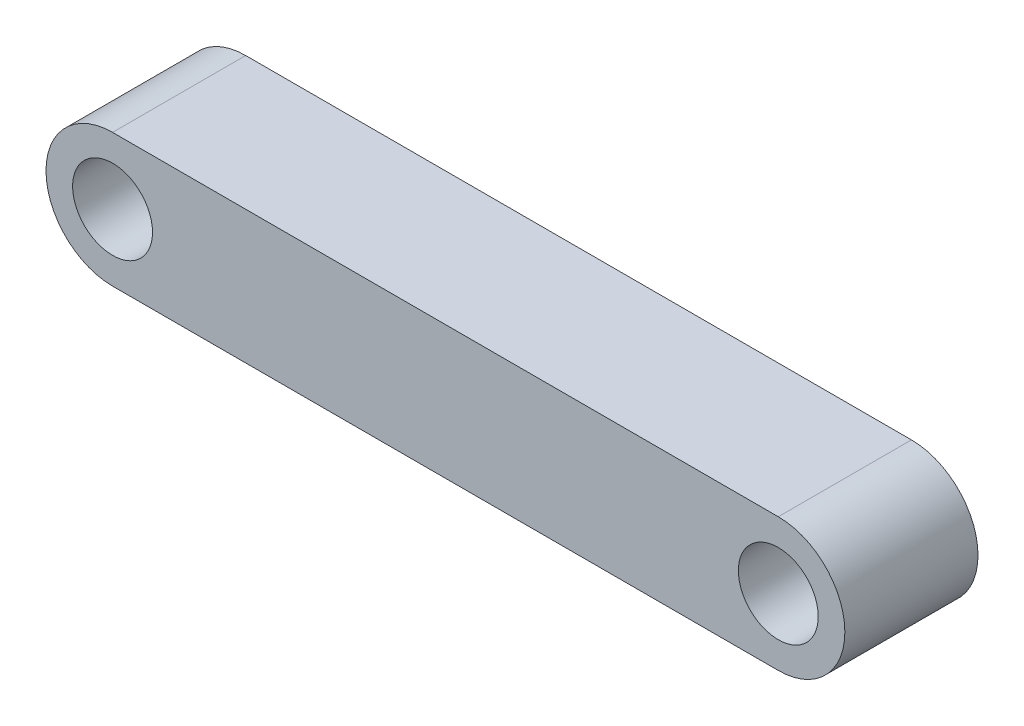
ISO-10303-21;
HEADER;
FILE_DESCRIPTION(('STEP AP214'),'2;1');
FILE_NAME('part.step','',(''),(''),'','','');
FILE_SCHEMA(('AUTOMOTIVE_DESIGN { 1 0 10303 214 1 1 1 1 }'));
ENDSEC;
DATA;
#1=APPLICATION_CONTEXT('core data for automotive mechanical design processes');
#2=APPLICATION_PROTOCOL_DEFINITION('international standard','automotive_design',2000,#1);
#3=PRODUCT_CONTEXT('',#1,'mechanical');
#4=PRODUCT('Part','Part','',(#3));
#5=PRODUCT_RELATED_PRODUCT_CATEGORY('part','',(#4));
#6=PRODUCT_DEFINITION_FORMATION('','',#4);
#7=PRODUCT_DEFINITION_CONTEXT('part definition',#1,'design');
#8=PRODUCT_DEFINITION('design','',#6,#7);
#9=PRODUCT_DEFINITION_SHAPE('','',#8);
#10=(LENGTH_UNIT() NAMED_UNIT(*) SI_UNIT(.MILLI.,.METRE.));
#11=(NAMED_UNIT(*) PLANE_ANGLE_UNIT() SI_UNIT($,.RADIAN.));
#12=(NAMED_UNIT(*) SI_UNIT($,.STERADIAN.) SOLID_ANGLE_UNIT());
#13=UNCERTAINTY_MEASURE_WITH_UNIT(LENGTH_MEASURE(1.E-05),#10,'distance_accuracy_value','');
#14=(GEOMETRIC_REPRESENTATION_CONTEXT(3) GLOBAL_UNCERTAINTY_ASSIGNED_CONTEXT((#13)) GLOBAL_UNIT_ASSIGNED_CONTEXT((#10,
#11,#12)) REPRESENTATION_CONTEXT('',''));
#15=CARTESIAN_POINT('',(0.,0.,0.));
#16=DIRECTION('',(0.,0.,1.));
#17=DIRECTION('',(1.,0.,0.));
#18=AXIS2_PLACEMENT_3D('',#15,#16,#17);
#19=CARTESIAN_POINT('',(-50.,0.,20.));
#20=DIRECTION('',(0.,0.,-1.));
#21=DIRECTION('',(-1.,0.,0.));
#22=AXIS2_PLACEMENT_3D('',#19,#20,#21);
#23=CYLINDRICAL_SURFACE('',#22,10.);
#24=CARTESIAN_POINT('',(-50.,0.,0.));
#25=DIRECTION('',(0.,0.,1.));
#26=DIRECTION('',(1.,0.,0.));
#27=AXIS2_PLACEMENT_3D('',#24,#25,#26);
#28=CIRCLE('',#27,10.);
#29=CARTESIAN_POINT('',(-50.,9.99999999999999,0.));
#30=VERTEX_POINT('',#29);
#31=CARTESIAN_POINT('',(-50.,-10.,0.));
#32=VERTEX_POINT('',#31);
#33=EDGE_CURVE('E97',#30,#32,#28,.T.);
#34=ORIENTED_EDGE('',*,*,#33,.T.);
#35=DIRECTION('',(0.,0.,-1.));
#36=VECTOR('',#35,1.);
#37=CARTESIAN_POINT('',(-50.,-10.,20.));
#38=LINE('',#37,#36);
#39=CARTESIAN_POINT('',(-50.,-10.,20.));
#40=VERTEX_POINT('',#39);
#41=EDGE_CURVE('E11',#40,#32,#38,.T.);
#42=ORIENTED_EDGE('',*,*,#41,.F.);
#43=CARTESIAN_POINT('',(-50.,0.,20.));
#44=DIRECTION('',(0.,0.,1.));
#45=DIRECTION('',(1.,0.,0.));
#46=AXIS2_PLACEMENT_3D('',#43,#44,#45);
#47=CIRCLE('',#46,10.);
#48=CARTESIAN_POINT('',(-50.,9.99999999999999,20.));
#49=VERTEX_POINT('',#48);
#50=EDGE_CURVE('E85',#49,#40,#47,.T.);
#51=ORIENTED_EDGE('',*,*,#50,.F.);
#52=DIRECTION('',(0.,0.,-1.));
#53=VECTOR('',#52,1.);
#54=CARTESIAN_POINT('',(-50.,9.99999999999999,20.));
#55=LINE('',#54,#53);
#56=EDGE_CURVE('E93',#49,#30,#55,.T.);
#57=ORIENTED_EDGE('',*,*,#56,.T.);
#58=EDGE_LOOP('',(#34,#42,#51,#57));
#59=FACE_BOUND('',#58,.T.);
#60=ADVANCED_FACE('F34',(#59),#23,.T.);
#61=CARTESIAN_POINT('',(50.,-10.,20.));
#62=DIRECTION('',(0.,1.,0.));
#63=DIRECTION('',(-1.,0.,0.));
#64=AXIS2_PLACEMENT_3D('',#61,#62,#63);
#65=PLANE('',#64);
#66=DIRECTION('',(1.,0.,0.));
#67=VECTOR('',#66,1.);
#68=CARTESIAN_POINT('',(50.,-10.,0.));
#69=LINE('',#68,#67);
#70=CARTESIAN_POINT('',(50.,-10.,0.));
#71=VERTEX_POINT('',#70);
#72=EDGE_CURVE('E89',#32,#71,#69,.T.);
#73=ORIENTED_EDGE('',*,*,#72,.T.);
#74=DIRECTION('',(0.,0.,-1.));
#75=VECTOR('',#74,1.);
#76=CARTESIAN_POINT('',(50.,-10.,20.));
#77=LINE('',#76,#75);
#78=CARTESIAN_POINT('',(50.,-10.,20.));
#79=VERTEX_POINT('',#78);
#80=EDGE_CURVE('E42',#79,#71,#77,.T.);
#81=ORIENTED_EDGE('',*,*,#80,.F.);
#82=DIRECTION('',(1.,0.,0.));
#83=VECTOR('',#82,1.);
#84=CARTESIAN_POINT('',(50.,-10.,20.));
#85=LINE('',#84,#83);
#86=EDGE_CURVE('E80',#40,#79,#85,.T.);
#87=ORIENTED_EDGE('',*,*,#86,.F.);
#88=ORIENTED_EDGE('',*,*,#41,.T.);
#89=EDGE_LOOP('',(#73,#81,#87,#88));
#90=FACE_BOUND('',#89,.T.);
#91=ADVANCED_FACE('F88',(#90),#65,.F.);
#92=CARTESIAN_POINT('',(50.,0.,20.));
#93=DIRECTION('',(0.,0.,-1.));
#94=DIRECTION('',(-1.,0.,0.));
#95=AXIS2_PLACEMENT_3D('',#92,#93,#94);
#96=CYLINDRICAL_SURFACE('',#95,10.);
#97=CARTESIAN_POINT('',(50.,0.,0.));
#98=DIRECTION('',(0.,0.,1.));
#99=DIRECTION('',(-1.,0.,0.));
#100=AXIS2_PLACEMENT_3D('',#97,#98,#99);
#101=CIRCLE('',#100,10.);
#102=CARTESIAN_POINT('',(50.,10.,0.));
#103=VERTEX_POINT('',#102);
#104=EDGE_CURVE('E67',#71,#103,#101,.T.);
#105=ORIENTED_EDGE('',*,*,#104,.T.);
#106=DIRECTION('',(0.,0.,-1.));
#107=VECTOR('',#106,1.);
#108=CARTESIAN_POINT('',(50.,10.,20.));
#109=LINE('',#108,#107);
#110=CARTESIAN_POINT('',(50.,10.,20.));
#111=VERTEX_POINT('',#110);
#112=EDGE_CURVE('E90',#111,#103,#109,.T.);
#113=ORIENTED_EDGE('',*,*,#112,.F.);
#114=CARTESIAN_POINT('',(50.,0.,20.));
#115=DIRECTION('',(0.,0.,1.));
#116=DIRECTION('',(-1.,0.,0.));
#117=AXIS2_PLACEMENT_3D('',#114,#115,#116);
#118=CIRCLE('',#117,10.);
#119=EDGE_CURVE('E83',#79,#111,#118,.T.);
#120=ORIENTED_EDGE('',*,*,#119,.F.);
#121=ORIENTED_EDGE('',*,*,#80,.T.);
#122=EDGE_LOOP('',(#105,#113,#120,#121));
#123=FACE_BOUND('',#122,.T.);
#124=ADVANCED_FACE('F91',(#123),#96,.T.);
#125=CARTESIAN_POINT('',(50.,10.,20.));
#126=DIRECTION('',(0.,-1.,0.));
#127=DIRECTION('',(1.,0.,0.));
#128=AXIS2_PLACEMENT_3D('',#125,#126,#127);
#129=PLANE('',#128);
#130=DIRECTION('',(-1.,0.,0.));
#131=VECTOR('',#130,1.);
#132=CARTESIAN_POINT('',(50.,10.,0.));
#133=LINE('',#132,#131);
#134=EDGE_CURVE('E73',#103,#30,#133,.T.);
#135=ORIENTED_EDGE('',*,*,#134,.T.);
#136=ORIENTED_EDGE('',*,*,#56,.F.);
#137=DIRECTION('',(-1.,0.,0.));
#138=VECTOR('',#137,1.);
#139=CARTESIAN_POINT('',(50.,10.,20.));
#140=LINE('',#139,#138);
#141=EDGE_CURVE('E50',#111,#49,#140,.T.);
#142=ORIENTED_EDGE('',*,*,#141,.F.);
#143=ORIENTED_EDGE('',*,*,#112,.T.);
#144=EDGE_LOOP('',(#135,#136,#142,#143));
#145=FACE_BOUND('',#144,.T.);
#146=ADVANCED_FACE('F105',(#145),#129,.F.);
#147=CARTESIAN_POINT('',(-50.,0.,20.));
#148=DIRECTION('',(0.,0.,1.));
#149=DIRECTION('',(1.,0.,0.));
#150=AXIS2_PLACEMENT_3D('',#147,#148,#149);
#151=PLANE('',#150);
#152=CARTESIAN_POINT('',(-50.,0.,20.));
#153=DIRECTION('',(0.,0.,1.));
#154=DIRECTION('',(1.,0.,0.));
#155=AXIS2_PLACEMENT_3D('',#152,#153,#154);
#156=CIRCLE('',#155,5.99999999999999);
#157=CARTESIAN_POINT('',(-44.,0.,20.));
#158=VERTEX_POINT('',#157);
#159=EDGE_CURVE('E117',#158,#158,#156,.T.);
#160=ORIENTED_EDGE('',*,*,#159,.F.);
#161=EDGE_LOOP('',(#160));
#162=FACE_BOUND('',#161,.T.);
#163=CARTESIAN_POINT('',(50.,0.,20.));
#164=DIRECTION('',(0.,0.,1.));
#165=DIRECTION('',(1.,0.,0.));
#166=AXIS2_PLACEMENT_3D('',#163,#164,#165);
#167=CIRCLE('',#166,5.99999999999999);
#168=CARTESIAN_POINT('',(56.,0.,20.));
#169=VERTEX_POINT('',#168);
#170=EDGE_CURVE('E111',#169,#169,#167,.T.);
#171=ORIENTED_EDGE('',*,*,#170,.F.);
#172=EDGE_LOOP('',(#171));
#173=FACE_BOUND('',#172,.T.);
#174=ORIENTED_EDGE('',*,*,#50,.T.);
#175=ORIENTED_EDGE('',*,*,#86,.T.);
#176=ORIENTED_EDGE('',*,*,#119,.T.);
#177=ORIENTED_EDGE('',*,*,#141,.T.);
#178=EDGE_LOOP('',(#174,#175,#176,#177));
#179=FACE_BOUND('',#178,.T.);
#180=ADVANCED_FACE('F81',(#162,#173,#179),#151,.T.);
#181=CARTESIAN_POINT('',(-50.,0.,0.));
#182=DIRECTION('',(0.,0.,1.));
#183=DIRECTION('',(1.,0.,0.));
#184=AXIS2_PLACEMENT_3D('',#181,#182,#183);
#185=PLANE('',#184);
#186=CARTESIAN_POINT('',(-50.,0.,0.));
#187=DIRECTION('',(0.,0.,1.));
#188=DIRECTION('',(1.,0.,0.));
#189=AXIS2_PLACEMENT_3D('',#186,#187,#188);
#190=CIRCLE('',#189,5.99999999999999);
#191=CARTESIAN_POINT('',(-44.,0.,0.));
#192=VERTEX_POINT('',#191);
#193=EDGE_CURVE('E100',#192,#192,#190,.T.);
#194=ORIENTED_EDGE('',*,*,#193,.T.);
#195=EDGE_LOOP('',(#194));
#196=FACE_BOUND('',#195,.T.);
#197=CARTESIAN_POINT('',(50.,0.,0.));
#198=DIRECTION('',(0.,0.,1.));
#199=DIRECTION('',(1.,0.,0.));
#200=AXIS2_PLACEMENT_3D('',#197,#198,#199);
#201=CIRCLE('',#200,5.99999999999999);
#202=CARTESIAN_POINT('',(56.,0.,0.));
#203=VERTEX_POINT('',#202);
#204=EDGE_CURVE('E114',#203,#203,#201,.T.);
#205=ORIENTED_EDGE('',*,*,#204,.T.);
#206=EDGE_LOOP('',(#205));
#207=FACE_BOUND('',#206,.T.);
#208=ORIENTED_EDGE('',*,*,#33,.F.);
#209=ORIENTED_EDGE('',*,*,#134,.F.);
#210=ORIENTED_EDGE('',*,*,#104,.F.);
#211=ORIENTED_EDGE('',*,*,#72,.F.);
#212=EDGE_LOOP('',(#208,#209,#210,#211));
#213=FACE_BOUND('',#212,.T.);
#214=ADVANCED_FACE('F108',(#196,#207,#213),#185,.F.);
#215=CARTESIAN_POINT('',(50.,0.,0.));
#216=DIRECTION('',(0.,0.,1.));
#217=DIRECTION('',(1.,0.,0.));
#218=AXIS2_PLACEMENT_3D('',#215,#216,#217);
#219=CYLINDRICAL_SURFACE('',#218,5.99999999999999);
#220=ORIENTED_EDGE('',*,*,#204,.F.);
#221=EDGE_LOOP('',(#220));
#222=FACE_BOUND('',#221,.T.);
#223=ORIENTED_EDGE('',*,*,#170,.T.);
#224=EDGE_LOOP('',(#223));
#225=FACE_BOUND('',#224,.T.);
#226=ADVANCED_FACE('F128',(#222,#225),#219,.F.);
#227=CARTESIAN_POINT('',(-50.,0.,0.));
#228=DIRECTION('',(0.,0.,1.));
#229=DIRECTION('',(1.,0.,0.));
#230=AXIS2_PLACEMENT_3D('',#227,#228,#229);
#231=CYLINDRICAL_SURFACE('',#230,5.99999999999999);
#232=ORIENTED_EDGE('',*,*,#193,.F.);
#233=EDGE_LOOP('',(#232));
#234=FACE_BOUND('',#233,.T.);
#235=ORIENTED_EDGE('',*,*,#159,.T.);
#236=EDGE_LOOP('',(#235));
#237=FACE_BOUND('',#236,.T.);
#238=ADVANCED_FACE('F125',(#234,#237),#231,.F.);
#239=CLOSED_SHELL('',(#60,#91,#124,#146,#180,#214,#226,#238));
#240=MANIFOLD_SOLID_BREP('B2',#239);
#241=ADVANCED_BREP_SHAPE_REPRESENTATION('',(#18,#240),#14);
#242=SHAPE_DEFINITION_REPRESENTATION(#9,#241);
ENDSEC;
END-ISO-10303-21;
